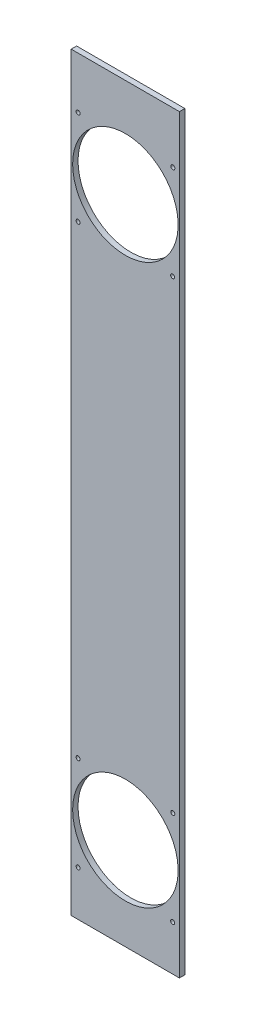
ISO-10303-21;
HEADER;
FILE_DESCRIPTION(('STEP AP214'),'2;1');
FILE_NAME('part.step','',(''),(''),'','','');
FILE_SCHEMA(('AUTOMOTIVE_DESIGN { 1 0 10303 214 1 1 1 1 }'));
ENDSEC;
DATA;
#1=APPLICATION_CONTEXT('core data for automotive mechanical design processes');
#2=APPLICATION_PROTOCOL_DEFINITION('international standard','automotive_design',2000,#1);
#3=PRODUCT_CONTEXT('',#1,'mechanical');
#4=PRODUCT('Part','Part','',(#3));
#5=PRODUCT_RELATED_PRODUCT_CATEGORY('part','',(#4));
#6=PRODUCT_DEFINITION_FORMATION('','',#4);
#7=PRODUCT_DEFINITION_CONTEXT('part definition',#1,'design');
#8=PRODUCT_DEFINITION('design','',#6,#7);
#9=PRODUCT_DEFINITION_SHAPE('','',#8);
#10=(LENGTH_UNIT() NAMED_UNIT(*) SI_UNIT(.MILLI.,.METRE.));
#11=(NAMED_UNIT(*) PLANE_ANGLE_UNIT() SI_UNIT($,.RADIAN.));
#12=(NAMED_UNIT(*) SI_UNIT($,.STERADIAN.) SOLID_ANGLE_UNIT());
#13=UNCERTAINTY_MEASURE_WITH_UNIT(LENGTH_MEASURE(1.E-05),#10,'distance_accuracy_value','');
#14=(GEOMETRIC_REPRESENTATION_CONTEXT(3) GLOBAL_UNCERTAINTY_ASSIGNED_CONTEXT((#13)) GLOBAL_UNIT_ASSIGNED_CONTEXT((#10,
#11,#12)) REPRESENTATION_CONTEXT('',''));
#15=CARTESIAN_POINT('',(0.,0.,0.));
#16=DIRECTION('',(0.,0.,1.));
#17=DIRECTION('',(1.,0.,0.));
#18=AXIS2_PLACEMENT_3D('',#15,#16,#17);
#19=CARTESIAN_POINT('',(60.,-416.,6.));
#20=DIRECTION('',(-1.,0.,0.));
#21=DIRECTION('',(0.,0.,1.));
#22=AXIS2_PLACEMENT_3D('',#19,#20,#21);
#23=PLANE('',#22);
#24=DIRECTION('',(0.,1.,0.));
#25=VECTOR('',#24,1.);
#26=CARTESIAN_POINT('',(60.,-416.,0.));
#27=LINE('',#26,#25);
#28=CARTESIAN_POINT('',(60.,-416.,0.));
#29=VERTEX_POINT('',#28);
#30=CARTESIAN_POINT('',(60.,416.,0.));
#31=VERTEX_POINT('',#30);
#32=EDGE_CURVE('E96',#29,#31,#27,.T.);
#33=ORIENTED_EDGE('',*,*,#32,.T.);
#34=DIRECTION('',(0.,0.,-1.));
#35=VECTOR('',#34,1.);
#36=CARTESIAN_POINT('',(60.,416.,6.));
#37=LINE('',#36,#35);
#38=CARTESIAN_POINT('',(60.,416.,6.));
#39=VERTEX_POINT('',#38);
#40=EDGE_CURVE('E11',#39,#31,#37,.T.);
#41=ORIENTED_EDGE('',*,*,#40,.F.);
#42=DIRECTION('',(0.,1.,0.));
#43=VECTOR('',#42,1.);
#44=CARTESIAN_POINT('',(60.,-416.,6.));
#45=LINE('',#44,#43);
#46=CARTESIAN_POINT('',(60.,-416.,6.));
#47=VERTEX_POINT('',#46);
#48=EDGE_CURVE('E84',#47,#39,#45,.T.);
#49=ORIENTED_EDGE('',*,*,#48,.F.);
#50=DIRECTION('',(0.,0.,-1.));
#51=VECTOR('',#50,1.);
#52=CARTESIAN_POINT('',(60.,-416.,6.));
#53=LINE('',#52,#51);
#54=EDGE_CURVE('E92',#47,#29,#53,.T.);
#55=ORIENTED_EDGE('',*,*,#54,.T.);
#56=EDGE_LOOP('',(#33,#41,#49,#55));
#57=FACE_BOUND('',#56,.T.);
#58=ADVANCED_FACE('F33',(#57),#23,.F.);
#59=CARTESIAN_POINT('',(-60.,416.,6.));
#60=DIRECTION('',(0.,-1.,0.));
#61=DIRECTION('',(0.,0.,-1.));
#62=AXIS2_PLACEMENT_3D('',#59,#60,#61);
#63=PLANE('',#62);
#64=DIRECTION('',(-1.,0.,0.));
#65=VECTOR('',#64,1.);
#66=CARTESIAN_POINT('',(-60.,416.,0.));
#67=LINE('',#66,#65);
#68=CARTESIAN_POINT('',(-60.,416.,0.));
#69=VERTEX_POINT('',#68);
#70=EDGE_CURVE('E88',#31,#69,#67,.T.);
#71=ORIENTED_EDGE('',*,*,#70,.T.);
#72=DIRECTION('',(0.,0.,-1.));
#73=VECTOR('',#72,1.);
#74=CARTESIAN_POINT('',(-60.,416.,6.));
#75=LINE('',#74,#73);
#76=CARTESIAN_POINT('',(-60.,416.,6.));
#77=VERTEX_POINT('',#76);
#78=EDGE_CURVE('E41',#77,#69,#75,.T.);
#79=ORIENTED_EDGE('',*,*,#78,.F.);
#80=DIRECTION('',(-1.,0.,0.));
#81=VECTOR('',#80,1.);
#82=CARTESIAN_POINT('',(-60.,416.,6.));
#83=LINE('',#82,#81);
#84=EDGE_CURVE('E79',#39,#77,#83,.T.);
#85=ORIENTED_EDGE('',*,*,#84,.F.);
#86=ORIENTED_EDGE('',*,*,#40,.T.);
#87=EDGE_LOOP('',(#71,#79,#85,#86));
#88=FACE_BOUND('',#87,.T.);
#89=ADVANCED_FACE('F87',(#88),#63,.F.);
#90=CARTESIAN_POINT('',(-60.,-416.,6.));
#91=DIRECTION('',(1.,0.,0.));
#92=DIRECTION('',(0.,0.,-1.));
#93=AXIS2_PLACEMENT_3D('',#90,#91,#92);
#94=PLANE('',#93);
#95=DIRECTION('',(0.,-1.,0.));
#96=VECTOR('',#95,1.);
#97=CARTESIAN_POINT('',(-60.,-416.,0.));
#98=LINE('',#97,#96);
#99=CARTESIAN_POINT('',(-60.,-416.,0.));
#100=VERTEX_POINT('',#99);
#101=EDGE_CURVE('E66',#69,#100,#98,.T.);
#102=ORIENTED_EDGE('',*,*,#101,.T.);
#103=DIRECTION('',(0.,0.,-1.));
#104=VECTOR('',#103,1.);
#105=CARTESIAN_POINT('',(-60.,-416.,6.));
#106=LINE('',#105,#104);
#107=CARTESIAN_POINT('',(-60.,-416.,6.));
#108=VERTEX_POINT('',#107);
#109=EDGE_CURVE('E89',#108,#100,#106,.T.);
#110=ORIENTED_EDGE('',*,*,#109,.F.);
#111=DIRECTION('',(0.,-1.,0.));
#112=VECTOR('',#111,1.);
#113=CARTESIAN_POINT('',(-60.,-416.,6.));
#114=LINE('',#113,#112);
#115=EDGE_CURVE('E82',#77,#108,#114,.T.);
#116=ORIENTED_EDGE('',*,*,#115,.F.);
#117=ORIENTED_EDGE('',*,*,#78,.T.);
#118=EDGE_LOOP('',(#102,#110,#116,#117));
#119=FACE_BOUND('',#118,.T.);
#120=ADVANCED_FACE('F90',(#119),#94,.F.);
#121=CARTESIAN_POINT('',(-60.,-416.,6.));
#122=DIRECTION('',(0.,1.,0.));
#123=DIRECTION('',(0.,0.,1.));
#124=AXIS2_PLACEMENT_3D('',#121,#122,#123);
#125=PLANE('',#124);
#126=DIRECTION('',(1.,0.,0.));
#127=VECTOR('',#126,1.);
#128=CARTESIAN_POINT('',(-60.,-416.,0.));
#129=LINE('',#128,#127);
#130=EDGE_CURVE('E72',#100,#29,#129,.T.);
#131=ORIENTED_EDGE('',*,*,#130,.T.);
#132=ORIENTED_EDGE('',*,*,#54,.F.);
#133=DIRECTION('',(1.,0.,0.));
#134=VECTOR('',#133,1.);
#135=CARTESIAN_POINT('',(-60.,-416.,6.));
#136=LINE('',#135,#134);
#137=EDGE_CURVE('E49',#108,#47,#136,.T.);
#138=ORIENTED_EDGE('',*,*,#137,.F.);
#139=ORIENTED_EDGE('',*,*,#109,.T.);
#140=EDGE_LOOP('',(#131,#132,#138,#139));
#141=FACE_BOUND('',#140,.T.);
#142=ADVANCED_FACE('F104',(#141),#125,.F.);
#143=CARTESIAN_POINT('',(0.,0.,6.));
#144=DIRECTION('',(0.,0.,-1.));
#145=DIRECTION('',(-1.,0.,0.));
#146=AXIS2_PLACEMENT_3D('',#143,#144,#145);
#147=PLANE('',#146);
#148=CARTESIAN_POINT('',(-52.3000000000001,-365.9,6.00000000000001));
#149=DIRECTION('',(0.,0.,-1.));
#150=DIRECTION('',(-1.,0.,0.));
#151=AXIS2_PLACEMENT_3D('',#148,#149,#150);
#152=CIRCLE('',#151,2.24999999999999);
#153=CARTESIAN_POINT('',(-54.5500000000001,-365.9,6.00000000000001));
#154=VERTEX_POINT('',#153);
#155=EDGE_CURVE('E163',#154,#154,#152,.T.);
#156=ORIENTED_EDGE('',*,*,#155,.T.);
#157=EDGE_LOOP('',(#156));
#158=FACE_BOUND('',#157,.T.);
#159=CARTESIAN_POINT('',(-52.3000000000001,-261.1,6.00000000000001));
#160=DIRECTION('',(0.,0.,-1.));
#161=DIRECTION('',(-1.,0.,0.));
#162=AXIS2_PLACEMENT_3D('',#159,#160,#161);
#163=CIRCLE('',#162,2.24999999999999);
#164=CARTESIAN_POINT('',(-54.5500000000001,-261.1,6.00000000000001));
#165=VERTEX_POINT('',#164);
#166=EDGE_CURVE('E157',#165,#165,#163,.T.);
#167=ORIENTED_EDGE('',*,*,#166,.T.);
#168=EDGE_LOOP('',(#167));
#169=FACE_BOUND('',#168,.T.);
#170=CARTESIAN_POINT('',(52.6999999999993,-261.100000000002,6.00000000000001));
#171=DIRECTION('',(0.,0.,-1.));
#172=DIRECTION('',(-1.,0.,0.));
#173=AXIS2_PLACEMENT_3D('',#170,#171,#172);
#174=CIRCLE('',#173,2.24999999999999);
#175=CARTESIAN_POINT('',(50.4499999999993,-261.100000000002,6.00000000000001));
#176=VERTEX_POINT('',#175);
#177=EDGE_CURVE('E151',#176,#176,#174,.T.);
#178=ORIENTED_EDGE('',*,*,#177,.T.);
#179=EDGE_LOOP('',(#178));
#180=FACE_BOUND('',#179,.T.);
#181=CARTESIAN_POINT('',(52.4999999999999,-365.9,6.00000000000001));
#182=DIRECTION('',(0.,0.,-1.));
#183=DIRECTION('',(-1.,0.,0.));
#184=AXIS2_PLACEMENT_3D('',#181,#182,#183);
#185=CIRCLE('',#184,2.24999999999999);
#186=CARTESIAN_POINT('',(50.2499999999999,-365.9,6.00000000000001));
#187=VERTEX_POINT('',#186);
#188=EDGE_CURVE('E145',#187,#187,#185,.T.);
#189=ORIENTED_EDGE('',*,*,#188,.T.);
#190=EDGE_LOOP('',(#189));
#191=FACE_BOUND('',#190,.T.);
#192=CARTESIAN_POINT('',(-52.3000000000001,254.1,6.00000000000001));
#193=DIRECTION('',(0.,0.,-1.));
#194=DIRECTION('',(-1.,0.,0.));
#195=AXIS2_PLACEMENT_3D('',#192,#193,#194);
#196=CIRCLE('',#195,2.24999999999999);
#197=CARTESIAN_POINT('',(-54.5500000000001,254.1,6.00000000000001));
#198=VERTEX_POINT('',#197);
#199=EDGE_CURVE('E139',#198,#198,#196,.T.);
#200=ORIENTED_EDGE('',*,*,#199,.T.);
#201=EDGE_LOOP('',(#200));
#202=FACE_BOUND('',#201,.T.);
#203=CARTESIAN_POINT('',(-52.3000000000001,358.9,6.00000000000001));
#204=DIRECTION('',(0.,0.,-1.));
#205=DIRECTION('',(-1.,0.,0.));
#206=AXIS2_PLACEMENT_3D('',#203,#204,#205);
#207=CIRCLE('',#206,2.24999999999999);
#208=CARTESIAN_POINT('',(-54.5500000000001,358.9,6.00000000000001));
#209=VERTEX_POINT('',#208);
#210=EDGE_CURVE('E133',#209,#209,#207,.T.);
#211=ORIENTED_EDGE('',*,*,#210,.T.);
#212=EDGE_LOOP('',(#211));
#213=FACE_BOUND('',#212,.T.);
#214=CARTESIAN_POINT('',(52.6999999999993,358.899999999998,6.00000000000001));
#215=DIRECTION('',(0.,0.,-1.));
#216=DIRECTION('',(-1.,0.,0.));
#217=AXIS2_PLACEMENT_3D('',#214,#215,#216);
#218=CIRCLE('',#217,2.24999999999999);
#219=CARTESIAN_POINT('',(50.4499999999993,358.899999999998,6.00000000000001));
#220=VERTEX_POINT('',#219);
#221=EDGE_CURVE('E127',#220,#220,#218,.T.);
#222=ORIENTED_EDGE('',*,*,#221,.T.);
#223=EDGE_LOOP('',(#222));
#224=FACE_BOUND('',#223,.T.);
#225=CARTESIAN_POINT('',(52.4999999999999,254.1,6.00000000000001));
#226=DIRECTION('',(0.,0.,-1.));
#227=DIRECTION('',(-1.,0.,0.));
#228=AXIS2_PLACEMENT_3D('',#225,#226,#227);
#229=CIRCLE('',#228,2.24999999999999);
#230=CARTESIAN_POINT('',(50.2499999999999,254.1,6.00000000000001));
#231=VERTEX_POINT('',#230);
#232=EDGE_CURVE('E121',#231,#231,#229,.T.);
#233=ORIENTED_EDGE('',*,*,#232,.T.);
#234=EDGE_LOOP('',(#233));
#235=FACE_BOUND('',#234,.T.);
#236=CARTESIAN_POINT('',(0.100000000000013,-313.5,6.));
#237=DIRECTION('',(0.,0.,-1.));
#238=DIRECTION('',(-1.,0.,0.));
#239=AXIS2_PLACEMENT_3D('',#236,#237,#238);
#240=CIRCLE('',#239,58.5);
#241=CARTESIAN_POINT('',(-58.4,-313.5,6.));
#242=VERTEX_POINT('',#241);
#243=EDGE_CURVE('E115',#242,#242,#240,.T.);
#244=ORIENTED_EDGE('',*,*,#243,.T.);
#245=EDGE_LOOP('',(#244));
#246=FACE_BOUND('',#245,.T.);
#247=CARTESIAN_POINT('',(0.100000000000013,306.5,6.));
#248=DIRECTION('',(0.,0.,-1.));
#249=DIRECTION('',(-1.,0.,0.));
#250=AXIS2_PLACEMENT_3D('',#247,#248,#249);
#251=CIRCLE('',#250,58.5);
#252=CARTESIAN_POINT('',(-58.4,306.5,6.));
#253=VERTEX_POINT('',#252);
#254=EDGE_CURVE('E99',#253,#253,#251,.T.);
#255=ORIENTED_EDGE('',*,*,#254,.T.);
#256=EDGE_LOOP('',(#255));
#257=FACE_BOUND('',#256,.T.);
#258=ORIENTED_EDGE('',*,*,#48,.T.);
#259=ORIENTED_EDGE('',*,*,#84,.T.);
#260=ORIENTED_EDGE('',*,*,#115,.T.);
#261=ORIENTED_EDGE('',*,*,#137,.T.);
#262=EDGE_LOOP('',(#258,#259,#260,#261));
#263=FACE_BOUND('',#262,.T.);
#264=ADVANCED_FACE('F80',(#158,#169,#180,#191,#202,#213,#224,#235,#246,#257,#263),#147,.F.);
#265=CARTESIAN_POINT('',(0.,0.,0.));
#266=DIRECTION('',(0.,0.,-1.));
#267=DIRECTION('',(-1.,0.,0.));
#268=AXIS2_PLACEMENT_3D('',#265,#266,#267);
#269=PLANE('',#268);
#270=CARTESIAN_POINT('',(-52.3000000000001,-365.9,0.));
#271=DIRECTION('',(0.,0.,-1.));
#272=DIRECTION('',(-1.,0.,0.));
#273=AXIS2_PLACEMENT_3D('',#270,#271,#272);
#274=CIRCLE('',#273,2.24999999999999);
#275=CARTESIAN_POINT('',(-54.5500000000001,-365.9,0.));
#276=VERTEX_POINT('',#275);
#277=EDGE_CURVE('E166',#276,#276,#274,.T.);
#278=ORIENTED_EDGE('',*,*,#277,.F.);
#279=EDGE_LOOP('',(#278));
#280=FACE_BOUND('',#279,.T.);
#281=CARTESIAN_POINT('',(-52.3000000000001,-261.1,0.));
#282=DIRECTION('',(0.,0.,-1.));
#283=DIRECTION('',(-1.,0.,0.));
#284=AXIS2_PLACEMENT_3D('',#281,#282,#283);
#285=CIRCLE('',#284,2.24999999999999);
#286=CARTESIAN_POINT('',(-54.5500000000001,-261.1,0.));
#287=VERTEX_POINT('',#286);
#288=EDGE_CURVE('E160',#287,#287,#285,.T.);
#289=ORIENTED_EDGE('',*,*,#288,.F.);
#290=EDGE_LOOP('',(#289));
#291=FACE_BOUND('',#290,.T.);
#292=CARTESIAN_POINT('',(52.6999999999993,-261.100000000002,0.));
#293=DIRECTION('',(0.,0.,-1.));
#294=DIRECTION('',(-1.,0.,0.));
#295=AXIS2_PLACEMENT_3D('',#292,#293,#294);
#296=CIRCLE('',#295,2.24999999999999);
#297=CARTESIAN_POINT('',(50.4499999999993,-261.100000000002,0.));
#298=VERTEX_POINT('',#297);
#299=EDGE_CURVE('E154',#298,#298,#296,.T.);
#300=ORIENTED_EDGE('',*,*,#299,.F.);
#301=EDGE_LOOP('',(#300));
#302=FACE_BOUND('',#301,.T.);
#303=CARTESIAN_POINT('',(52.4999999999999,-365.9,0.));
#304=DIRECTION('',(0.,0.,-1.));
#305=DIRECTION('',(-1.,0.,0.));
#306=AXIS2_PLACEMENT_3D('',#303,#304,#305);
#307=CIRCLE('',#306,2.24999999999999);
#308=CARTESIAN_POINT('',(50.2499999999999,-365.9,0.));
#309=VERTEX_POINT('',#308);
#310=EDGE_CURVE('E148',#309,#309,#307,.T.);
#311=ORIENTED_EDGE('',*,*,#310,.F.);
#312=EDGE_LOOP('',(#311));
#313=FACE_BOUND('',#312,.T.);
#314=CARTESIAN_POINT('',(-52.3000000000001,254.1,0.));
#315=DIRECTION('',(0.,0.,-1.));
#316=DIRECTION('',(-1.,0.,0.));
#317=AXIS2_PLACEMENT_3D('',#314,#315,#316);
#318=CIRCLE('',#317,2.24999999999999);
#319=CARTESIAN_POINT('',(-54.5500000000001,254.1,0.));
#320=VERTEX_POINT('',#319);
#321=EDGE_CURVE('E142',#320,#320,#318,.T.);
#322=ORIENTED_EDGE('',*,*,#321,.F.);
#323=EDGE_LOOP('',(#322));
#324=FACE_BOUND('',#323,.T.);
#325=CARTESIAN_POINT('',(-52.3000000000001,358.9,0.));
#326=DIRECTION('',(0.,0.,-1.));
#327=DIRECTION('',(-1.,0.,0.));
#328=AXIS2_PLACEMENT_3D('',#325,#326,#327);
#329=CIRCLE('',#328,2.24999999999999);
#330=CARTESIAN_POINT('',(-54.5500000000001,358.9,0.));
#331=VERTEX_POINT('',#330);
#332=EDGE_CURVE('E136',#331,#331,#329,.T.);
#333=ORIENTED_EDGE('',*,*,#332,.F.);
#334=EDGE_LOOP('',(#333));
#335=FACE_BOUND('',#334,.T.);
#336=CARTESIAN_POINT('',(52.6999999999993,358.899999999998,0.));
#337=DIRECTION('',(0.,0.,-1.));
#338=DIRECTION('',(-1.,0.,0.));
#339=AXIS2_PLACEMENT_3D('',#336,#337,#338);
#340=CIRCLE('',#339,2.24999999999999);
#341=CARTESIAN_POINT('',(50.4499999999993,358.899999999998,0.));
#342=VERTEX_POINT('',#341);
#343=EDGE_CURVE('E130',#342,#342,#340,.T.);
#344=ORIENTED_EDGE('',*,*,#343,.F.);
#345=EDGE_LOOP('',(#344));
#346=FACE_BOUND('',#345,.T.);
#347=CARTESIAN_POINT('',(52.4999999999999,254.1,0.));
#348=DIRECTION('',(0.,0.,-1.));
#349=DIRECTION('',(-1.,0.,0.));
#350=AXIS2_PLACEMENT_3D('',#347,#348,#349);
#351=CIRCLE('',#350,2.24999999999999);
#352=CARTESIAN_POINT('',(50.2499999999999,254.1,0.));
#353=VERTEX_POINT('',#352);
#354=EDGE_CURVE('E124',#353,#353,#351,.T.);
#355=ORIENTED_EDGE('',*,*,#354,.F.);
#356=EDGE_LOOP('',(#355));
#357=FACE_BOUND('',#356,.T.);
#358=CARTESIAN_POINT('',(0.100000000000013,-313.5,0.));
#359=DIRECTION('',(0.,0.,-1.));
#360=DIRECTION('',(-1.,0.,0.));
#361=AXIS2_PLACEMENT_3D('',#358,#359,#360);
#362=CIRCLE('',#361,58.5);
#363=CARTESIAN_POINT('',(-58.4,-313.5,0.));
#364=VERTEX_POINT('',#363);
#365=EDGE_CURVE('E118',#364,#364,#362,.T.);
#366=ORIENTED_EDGE('',*,*,#365,.F.);
#367=EDGE_LOOP('',(#366));
#368=FACE_BOUND('',#367,.T.);
#369=CARTESIAN_POINT('',(0.100000000000013,306.5,0.));
#370=DIRECTION('',(0.,0.,-1.));
#371=DIRECTION('',(-1.,0.,0.));
#372=AXIS2_PLACEMENT_3D('',#369,#370,#371);
#373=CIRCLE('',#372,58.5);
#374=CARTESIAN_POINT('',(-58.4,306.5,0.));
#375=VERTEX_POINT('',#374);
#376=EDGE_CURVE('E112',#375,#375,#373,.T.);
#377=ORIENTED_EDGE('',*,*,#376,.F.);
#378=EDGE_LOOP('',(#377));
#379=FACE_BOUND('',#378,.T.);
#380=ORIENTED_EDGE('',*,*,#32,.F.);
#381=ORIENTED_EDGE('',*,*,#130,.F.);
#382=ORIENTED_EDGE('',*,*,#101,.F.);
#383=ORIENTED_EDGE('',*,*,#70,.F.);
#384=EDGE_LOOP('',(#380,#381,#382,#383));
#385=FACE_BOUND('',#384,.T.);
#386=ADVANCED_FACE('F107',(#280,#291,#302,#313,#324,#335,#346,#357,#368,#379,#385),#269,.T.);
#387=CARTESIAN_POINT('',(0.100000000000013,306.5,10.));
#388=DIRECTION('',(0.,0.,-1.));
#389=DIRECTION('',(-1.,0.,0.));
#390=AXIS2_PLACEMENT_3D('',#387,#388,#389);
#391=CYLINDRICAL_SURFACE('',#390,58.5);
#392=ORIENTED_EDGE('',*,*,#376,.T.);
#393=EDGE_LOOP('',(#392));
#394=FACE_BOUND('',#393,.T.);
#395=ORIENTED_EDGE('',*,*,#254,.F.);
#396=EDGE_LOOP('',(#395));
#397=FACE_BOUND('',#396,.T.);
#398=ADVANCED_FACE('F174',(#394,#397),#391,.F.);
#399=CARTESIAN_POINT('',(0.100000000000013,-313.5,10.));
#400=DIRECTION('',(0.,0.,-1.));
#401=DIRECTION('',(-1.,0.,0.));
#402=AXIS2_PLACEMENT_3D('',#399,#400,#401);
#403=CYLINDRICAL_SURFACE('',#402,58.5);
#404=ORIENTED_EDGE('',*,*,#365,.T.);
#405=EDGE_LOOP('',(#404));
#406=FACE_BOUND('',#405,.T.);
#407=ORIENTED_EDGE('',*,*,#243,.F.);
#408=EDGE_LOOP('',(#407));
#409=FACE_BOUND('',#408,.T.);
#410=ADVANCED_FACE('F196',(#406,#409),#403,.F.);
#411=CARTESIAN_POINT('',(52.4999999999999,254.1,0.));
#412=DIRECTION('',(0.,0.,-1.));
#413=DIRECTION('',(-1.,0.,0.));
#414=AXIS2_PLACEMENT_3D('',#411,#412,#413);
#415=CYLINDRICAL_SURFACE('',#414,2.24999999999999);
#416=ORIENTED_EDGE('',*,*,#232,.F.);
#417=EDGE_LOOP('',(#416));
#418=FACE_BOUND('',#417,.T.);
#419=ORIENTED_EDGE('',*,*,#354,.T.);
#420=EDGE_LOOP('',(#419));
#421=FACE_BOUND('',#420,.T.);
#422=ADVANCED_FACE('F244',(#418,#421),#415,.F.);
#423=CARTESIAN_POINT('',(52.6999999999993,358.899999999998,0.));
#424=DIRECTION('',(0.,0.,-1.));
#425=DIRECTION('',(-1.,0.,0.));
#426=AXIS2_PLACEMENT_3D('',#423,#424,#425);
#427=CYLINDRICAL_SURFACE('',#426,2.24999999999999);
#428=ORIENTED_EDGE('',*,*,#221,.F.);
#429=EDGE_LOOP('',(#428));
#430=FACE_BOUND('',#429,.T.);
#431=ORIENTED_EDGE('',*,*,#343,.T.);
#432=EDGE_LOOP('',(#431));
#433=FACE_BOUND('',#432,.T.);
#434=ADVANCED_FACE('F252',(#430,#433),#427,.F.);
#435=CARTESIAN_POINT('',(-52.3000000000001,358.9,0.));
#436=DIRECTION('',(0.,0.,-1.));
#437=DIRECTION('',(-1.,0.,0.));
#438=AXIS2_PLACEMENT_3D('',#435,#436,#437);
#439=CYLINDRICAL_SURFACE('',#438,2.24999999999999);
#440=ORIENTED_EDGE('',*,*,#210,.F.);
#441=EDGE_LOOP('',(#440));
#442=FACE_BOUND('',#441,.T.);
#443=ORIENTED_EDGE('',*,*,#332,.T.);
#444=EDGE_LOOP('',(#443));
#445=FACE_BOUND('',#444,.T.);
#446=ADVANCED_FACE('F260',(#442,#445),#439,.F.);
#447=CARTESIAN_POINT('',(-52.3000000000001,254.1,0.));
#448=DIRECTION('',(0.,0.,-1.));
#449=DIRECTION('',(-1.,0.,0.));
#450=AXIS2_PLACEMENT_3D('',#447,#448,#449);
#451=CYLINDRICAL_SURFACE('',#450,2.24999999999999);
#452=ORIENTED_EDGE('',*,*,#199,.F.);
#453=EDGE_LOOP('',(#452));
#454=FACE_BOUND('',#453,.T.);
#455=ORIENTED_EDGE('',*,*,#321,.T.);
#456=EDGE_LOOP('',(#455));
#457=FACE_BOUND('',#456,.T.);
#458=ADVANCED_FACE('F268',(#454,#457),#451,.F.);
#459=CARTESIAN_POINT('',(52.4999999999999,-365.9,0.));
#460=DIRECTION('',(0.,0.,-1.));
#461=DIRECTION('',(-1.,0.,0.));
#462=AXIS2_PLACEMENT_3D('',#459,#460,#461);
#463=CYLINDRICAL_SURFACE('',#462,2.24999999999999);
#464=ORIENTED_EDGE('',*,*,#188,.F.);
#465=EDGE_LOOP('',(#464));
#466=FACE_BOUND('',#465,.T.);
#467=ORIENTED_EDGE('',*,*,#310,.T.);
#468=EDGE_LOOP('',(#467));
#469=FACE_BOUND('',#468,.T.);
#470=ADVANCED_FACE('F275',(#466,#469),#463,.F.);
#471=CARTESIAN_POINT('',(52.6999999999993,-261.100000000002,0.));
#472=DIRECTION('',(0.,0.,-1.));
#473=DIRECTION('',(-1.,0.,0.));
#474=AXIS2_PLACEMENT_3D('',#471,#472,#473);
#475=CYLINDRICAL_SURFACE('',#474,2.24999999999999);
#476=ORIENTED_EDGE('',*,*,#177,.F.);
#477=EDGE_LOOP('',(#476));
#478=FACE_BOUND('',#477,.T.);
#479=ORIENTED_EDGE('',*,*,#299,.T.);
#480=EDGE_LOOP('',(#479));
#481=FACE_BOUND('',#480,.T.);
#482=ADVANCED_FACE('F282',(#478,#481),#475,.F.);
#483=CARTESIAN_POINT('',(-52.3000000000001,-261.1,0.));
#484=DIRECTION('',(0.,0.,-1.));
#485=DIRECTION('',(-1.,0.,0.));
#486=AXIS2_PLACEMENT_3D('',#483,#484,#485);
#487=CYLINDRICAL_SURFACE('',#486,2.24999999999999);
#488=ORIENTED_EDGE('',*,*,#166,.F.);
#489=EDGE_LOOP('',(#488));
#490=FACE_BOUND('',#489,.T.);
#491=ORIENTED_EDGE('',*,*,#288,.T.);
#492=EDGE_LOOP('',(#491));
#493=FACE_BOUND('',#492,.T.);
#494=ADVANCED_FACE('F290',(#490,#493),#487,.F.);
#495=CARTESIAN_POINT('',(-52.3000000000001,-365.9,0.));
#496=DIRECTION('',(0.,0.,-1.));
#497=DIRECTION('',(-1.,0.,0.));
#498=AXIS2_PLACEMENT_3D('',#495,#496,#497);
#499=CYLINDRICAL_SURFACE('',#498,2.24999999999999);
#500=ORIENTED_EDGE('',*,*,#155,.F.);
#501=EDGE_LOOP('',(#500));
#502=FACE_BOUND('',#501,.T.);
#503=ORIENTED_EDGE('',*,*,#277,.T.);
#504=EDGE_LOOP('',(#503));
#505=FACE_BOUND('',#504,.T.);
#506=ADVANCED_FACE('F170',(#502,#505),#499,.F.);
#507=CLOSED_SHELL('',(#58,#89,#120,#142,#264,#386,#398,#410,#422,#434,#446,#458,#470,#482,#494,#506));
#508=MANIFOLD_SOLID_BREP('B2',#507);
#509=ADVANCED_BREP_SHAPE_REPRESENTATION('',(#18,#508),#14);
#510=SHAPE_DEFINITION_REPRESENTATION(#9,#509);
ENDSEC;
END-ISO-10303-21;
